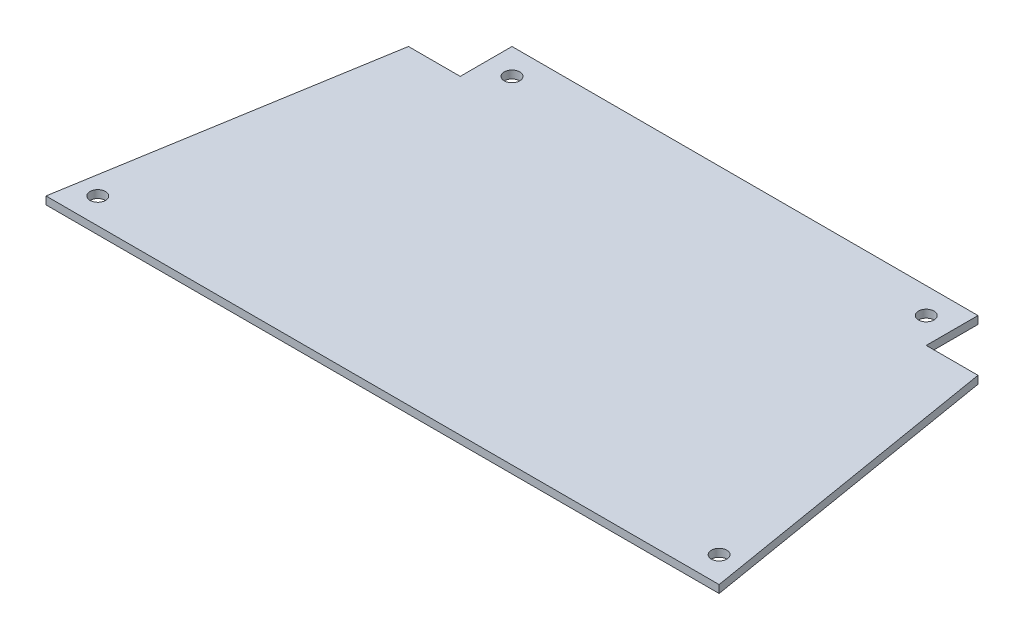
ISO-10303-21;
HEADER;
FILE_DESCRIPTION(('STEP AP214'),'2;1');
FILE_NAME('part.step','',(''),(''),'','','');
FILE_SCHEMA(('AUTOMOTIVE_DESIGN { 1 0 10303 214 1 1 1 1 }'));
ENDSEC;
DATA;
#1=APPLICATION_CONTEXT('core data for automotive mechanical design processes');
#2=APPLICATION_PROTOCOL_DEFINITION('international standard','automotive_design',2000,#1);
#3=PRODUCT_CONTEXT('',#1,'mechanical');
#4=PRODUCT('Part','Part','',(#3));
#5=PRODUCT_RELATED_PRODUCT_CATEGORY('part','',(#4));
#6=PRODUCT_DEFINITION_FORMATION('','',#4);
#7=PRODUCT_DEFINITION_CONTEXT('part definition',#1,'design');
#8=PRODUCT_DEFINITION('design','',#6,#7);
#9=PRODUCT_DEFINITION_SHAPE('','',#8);
#10=(LENGTH_UNIT() NAMED_UNIT(*) SI_UNIT(.MILLI.,.METRE.));
#11=(NAMED_UNIT(*) PLANE_ANGLE_UNIT() SI_UNIT($,.RADIAN.));
#12=(NAMED_UNIT(*) SI_UNIT($,.STERADIAN.) SOLID_ANGLE_UNIT());
#13=UNCERTAINTY_MEASURE_WITH_UNIT(LENGTH_MEASURE(1.E-05),#10,'distance_accuracy_value','');
#14=(GEOMETRIC_REPRESENTATION_CONTEXT(3) GLOBAL_UNCERTAINTY_ASSIGNED_CONTEXT((#13)) GLOBAL_UNIT_ASSIGNED_CONTEXT((#10,
#11,#12)) REPRESENTATION_CONTEXT('',''));
#15=CARTESIAN_POINT('',(0.,0.,0.));
#16=DIRECTION('',(0.,0.,1.));
#17=DIRECTION('',(1.,0.,0.));
#18=AXIS2_PLACEMENT_3D('',#15,#16,#17);
#19=CARTESIAN_POINT('',(10.,1.5,-60.));
#20=DIRECTION('',(0.986393923832144,0.,0.164398987305357));
#21=DIRECTION('',(0.164398987305357,0.,-0.986393923832144));
#22=AXIS2_PLACEMENT_3D('',#19,#20,#21);
#23=PLANE('',#22);
#24=DIRECTION('',(-0.164398987305357,0.,0.986393923832144));
#25=VECTOR('',#24,1.);
#26=CARTESIAN_POINT('',(10.,0.,-60.));
#27=LINE('',#26,#25);
#28=CARTESIAN_POINT('',(10.,0.,-60.));
#29=VERTEX_POINT('',#28);
#30=CARTESIAN_POINT('',(0.,0.,0.));
#31=VERTEX_POINT('',#30);
#32=EDGE_CURVE('E130',#29,#31,#27,.T.);
#33=ORIENTED_EDGE('',*,*,#32,.T.);
#34=DIRECTION('',(0.,-1.,0.));
#35=VECTOR('',#34,1.);
#36=CARTESIAN_POINT('',(0.,1.5,0.));
#37=LINE('',#36,#35);
#38=CARTESIAN_POINT('',(0.,1.5,0.));
#39=VERTEX_POINT('',#38);
#40=EDGE_CURVE('E11',#39,#31,#37,.T.);
#41=ORIENTED_EDGE('',*,*,#40,.F.);
#42=DIRECTION('',(-0.164398987305357,0.,0.986393923832144));
#43=VECTOR('',#42,1.);
#44=CARTESIAN_POINT('',(10.,1.5,-60.));
#45=LINE('',#44,#43);
#46=CARTESIAN_POINT('',(10.,1.5,-60.));
#47=VERTEX_POINT('',#46);
#48=EDGE_CURVE('E145',#47,#39,#45,.T.);
#49=ORIENTED_EDGE('',*,*,#48,.F.);
#50=DIRECTION('',(0.,-1.,0.));
#51=VECTOR('',#50,1.);
#52=CARTESIAN_POINT('',(10.,1.5,-60.));
#53=LINE('',#52,#51);
#54=EDGE_CURVE('E126',#47,#29,#53,.T.);
#55=ORIENTED_EDGE('',*,*,#54,.T.);
#56=EDGE_LOOP('',(#33,#41,#49,#55));
#57=FACE_BOUND('',#56,.T.);
#58=ADVANCED_FACE('F32',(#57),#23,.F.);
#59=CARTESIAN_POINT('',(0.,1.5,0.));
#60=DIRECTION('',(0.,0.,-1.));
#61=DIRECTION('',(-1.,0.,0.));
#62=AXIS2_PLACEMENT_3D('',#59,#60,#61);
#63=PLANE('',#62);
#64=DIRECTION('',(1.,0.,0.));
#65=VECTOR('',#64,1.);
#66=CARTESIAN_POINT('',(0.,0.,0.));
#67=LINE('',#66,#65);
#68=CARTESIAN_POINT('',(130.,0.,0.));
#69=VERTEX_POINT('',#68);
#70=EDGE_CURVE('E133',#31,#69,#67,.T.);
#71=ORIENTED_EDGE('',*,*,#70,.T.);
#72=DIRECTION('',(0.,-1.,0.));
#73=VECTOR('',#72,1.);
#74=CARTESIAN_POINT('',(130.,1.5,0.));
#75=LINE('',#74,#73);
#76=CARTESIAN_POINT('',(130.,1.5,0.));
#77=VERTEX_POINT('',#76);
#78=EDGE_CURVE('E41',#77,#69,#75,.T.);
#79=ORIENTED_EDGE('',*,*,#78,.F.);
#80=DIRECTION('',(1.,0.,0.));
#81=VECTOR('',#80,1.);
#82=CARTESIAN_POINT('',(0.,1.5,0.));
#83=LINE('',#82,#81);
#84=EDGE_CURVE('E93',#39,#77,#83,.T.);
#85=ORIENTED_EDGE('',*,*,#84,.F.);
#86=ORIENTED_EDGE('',*,*,#40,.T.);
#87=EDGE_LOOP('',(#71,#79,#85,#86));
#88=FACE_BOUND('',#87,.T.);
#89=ADVANCED_FACE('F212',(#88),#63,.F.);
#90=CARTESIAN_POINT('',(130.,1.5,0.));
#91=DIRECTION('',(-0.986393923832144,0.,0.164398987305357));
#92=DIRECTION('',(0.164398987305357,0.,0.986393923832144));
#93=AXIS2_PLACEMENT_3D('',#90,#91,#92);
#94=PLANE('',#93);
#95=DIRECTION('',(-0.164398987305357,0.,-0.986393923832144));
#96=VECTOR('',#95,1.);
#97=CARTESIAN_POINT('',(130.,0.,0.));
#98=LINE('',#97,#96);
#99=CARTESIAN_POINT('',(120.,0.,-60.));
#100=VERTEX_POINT('',#99);
#101=EDGE_CURVE('E136',#69,#100,#98,.T.);
#102=ORIENTED_EDGE('',*,*,#101,.T.);
#103=DIRECTION('',(0.,-1.,0.));
#104=VECTOR('',#103,1.);
#105=CARTESIAN_POINT('',(120.,1.5,-60.));
#106=LINE('',#105,#104);
#107=CARTESIAN_POINT('',(120.,1.5,-60.));
#108=VERTEX_POINT('',#107);
#109=EDGE_CURVE('E152',#108,#100,#106,.T.);
#110=ORIENTED_EDGE('',*,*,#109,.F.);
#111=DIRECTION('',(-0.164398987305357,0.,-0.986393923832144));
#112=VECTOR('',#111,1.);
#113=CARTESIAN_POINT('',(130.,1.5,0.));
#114=LINE('',#113,#112);
#115=EDGE_CURVE('E180',#77,#108,#114,.T.);
#116=ORIENTED_EDGE('',*,*,#115,.F.);
#117=ORIENTED_EDGE('',*,*,#78,.T.);
#118=EDGE_LOOP('',(#102,#110,#116,#117));
#119=FACE_BOUND('',#118,.T.);
#120=ADVANCED_FACE('F216',(#119),#94,.F.);
#121=CARTESIAN_POINT('',(120.,1.5,-60.));
#122=DIRECTION('',(0.,0.,1.));
#123=DIRECTION('',(1.,0.,0.));
#124=AXIS2_PLACEMENT_3D('',#121,#122,#123);
#125=PLANE('',#124);
#126=DIRECTION('',(-1.,0.,0.));
#127=VECTOR('',#126,1.);
#128=CARTESIAN_POINT('',(120.,0.,-60.));
#129=LINE('',#128,#127);
#130=CARTESIAN_POINT('',(110.,0.,-60.));
#131=VERTEX_POINT('',#130);
#132=EDGE_CURVE('E138',#100,#131,#129,.T.);
#133=ORIENTED_EDGE('',*,*,#132,.T.);
#134=DIRECTION('',(0.,-1.,0.));
#135=VECTOR('',#134,1.);
#136=CARTESIAN_POINT('',(110.,1.5,-60.));
#137=LINE('',#136,#135);
#138=CARTESIAN_POINT('',(110.,1.5,-60.));
#139=VERTEX_POINT('',#138);
#140=EDGE_CURVE('E149',#139,#131,#137,.T.);
#141=ORIENTED_EDGE('',*,*,#140,.F.);
#142=DIRECTION('',(-1.,0.,0.));
#143=VECTOR('',#142,1.);
#144=CARTESIAN_POINT('',(120.,1.5,-60.));
#145=LINE('',#144,#143);
#146=EDGE_CURVE('E182',#108,#139,#145,.T.);
#147=ORIENTED_EDGE('',*,*,#146,.F.);
#148=ORIENTED_EDGE('',*,*,#109,.T.);
#149=EDGE_LOOP('',(#133,#141,#147,#148));
#150=FACE_BOUND('',#149,.T.);
#151=ADVANCED_FACE('F188',(#150),#125,.F.);
#152=CARTESIAN_POINT('',(110.,1.5,-60.));
#153=DIRECTION('',(-1.,0.,0.));
#154=DIRECTION('',(0.,0.,1.));
#155=AXIS2_PLACEMENT_3D('',#152,#153,#154);
#156=PLANE('',#155);
#157=DIRECTION('',(0.,0.,-1.));
#158=VECTOR('',#157,1.);
#159=CARTESIAN_POINT('',(110.,0.,-60.));
#160=LINE('',#159,#158);
#161=CARTESIAN_POINT('',(110.,0.,-70.));
#162=VERTEX_POINT('',#161);
#163=EDGE_CURVE('E140',#131,#162,#160,.T.);
#164=ORIENTED_EDGE('',*,*,#163,.T.);
#165=DIRECTION('',(0.,-1.,0.));
#166=VECTOR('',#165,1.);
#167=CARTESIAN_POINT('',(110.,1.5,-70.));
#168=LINE('',#167,#166);
#169=CARTESIAN_POINT('',(110.,1.5,-70.));
#170=VERTEX_POINT('',#169);
#171=EDGE_CURVE('E121',#170,#162,#168,.T.);
#172=ORIENTED_EDGE('',*,*,#171,.F.);
#173=DIRECTION('',(0.,0.,-1.));
#174=VECTOR('',#173,1.);
#175=CARTESIAN_POINT('',(110.,1.5,-60.));
#176=LINE('',#175,#174);
#177=EDGE_CURVE('E112',#139,#170,#176,.T.);
#178=ORIENTED_EDGE('',*,*,#177,.F.);
#179=ORIENTED_EDGE('',*,*,#140,.T.);
#180=EDGE_LOOP('',(#164,#172,#178,#179));
#181=FACE_BOUND('',#180,.T.);
#182=ADVANCED_FACE('F192',(#181),#156,.F.);
#183=CARTESIAN_POINT('',(110.,1.5,-70.));
#184=DIRECTION('',(0.,0.,1.));
#185=DIRECTION('',(1.,0.,0.));
#186=AXIS2_PLACEMENT_3D('',#183,#184,#185);
#187=PLANE('',#186);
#188=DIRECTION('',(-1.,0.,0.));
#189=VECTOR('',#188,1.);
#190=CARTESIAN_POINT('',(110.,0.,-70.));
#191=LINE('',#190,#189);
#192=CARTESIAN_POINT('',(20.,0.,-70.));
#193=VERTEX_POINT('',#192);
#194=EDGE_CURVE('E120',#162,#193,#191,.T.);
#195=ORIENTED_EDGE('',*,*,#194,.T.);
#196=DIRECTION('',(0.,-1.,0.));
#197=VECTOR('',#196,1.);
#198=CARTESIAN_POINT('',(20.,1.5,-70.));
#199=LINE('',#198,#197);
#200=CARTESIAN_POINT('',(20.,1.5,-70.));
#201=VERTEX_POINT('',#200);
#202=EDGE_CURVE('E117',#201,#193,#199,.T.);
#203=ORIENTED_EDGE('',*,*,#202,.F.);
#204=DIRECTION('',(-1.,0.,0.));
#205=VECTOR('',#204,1.);
#206=CARTESIAN_POINT('',(110.,1.5,-70.));
#207=LINE('',#206,#205);
#208=EDGE_CURVE('E106',#170,#201,#207,.T.);
#209=ORIENTED_EDGE('',*,*,#208,.F.);
#210=ORIENTED_EDGE('',*,*,#171,.T.);
#211=EDGE_LOOP('',(#195,#203,#209,#210));
#212=FACE_BOUND('',#211,.T.);
#213=ADVANCED_FACE('F118',(#212),#187,.F.);
#214=CARTESIAN_POINT('',(20.,1.5,-70.));
#215=DIRECTION('',(1.,0.,0.));
#216=DIRECTION('',(0.,0.,-1.));
#217=AXIS2_PLACEMENT_3D('',#214,#215,#216);
#218=PLANE('',#217);
#219=DIRECTION('',(0.,0.,1.));
#220=VECTOR('',#219,1.);
#221=CARTESIAN_POINT('',(20.,0.,-70.));
#222=LINE('',#221,#220);
#223=CARTESIAN_POINT('',(20.,0.,-60.));
#224=VERTEX_POINT('',#223);
#225=EDGE_CURVE('E79',#193,#224,#222,.T.);
#226=ORIENTED_EDGE('',*,*,#225,.T.);
#227=DIRECTION('',(0.,-1.,0.));
#228=VECTOR('',#227,1.);
#229=CARTESIAN_POINT('',(20.,1.5,-60.));
#230=LINE('',#229,#228);
#231=CARTESIAN_POINT('',(20.,1.5,-60.));
#232=VERTEX_POINT('',#231);
#233=EDGE_CURVE('E122',#232,#224,#230,.T.);
#234=ORIENTED_EDGE('',*,*,#233,.F.);
#235=DIRECTION('',(0.,0.,1.));
#236=VECTOR('',#235,1.);
#237=CARTESIAN_POINT('',(20.,1.5,-70.));
#238=LINE('',#237,#236);
#239=EDGE_CURVE('E110',#201,#232,#238,.T.);
#240=ORIENTED_EDGE('',*,*,#239,.F.);
#241=ORIENTED_EDGE('',*,*,#202,.T.);
#242=EDGE_LOOP('',(#226,#234,#240,#241));
#243=FACE_BOUND('',#242,.T.);
#244=ADVANCED_FACE('F124',(#243),#218,.F.);
#245=CARTESIAN_POINT('',(20.,1.5,-60.));
#246=DIRECTION('',(0.,0.,1.));
#247=DIRECTION('',(1.,0.,0.));
#248=AXIS2_PLACEMENT_3D('',#245,#246,#247);
#249=PLANE('',#248);
#250=DIRECTION('',(-1.,0.,0.));
#251=VECTOR('',#250,1.);
#252=CARTESIAN_POINT('',(20.,0.,-60.));
#253=LINE('',#252,#251);
#254=EDGE_CURVE('E85',#224,#29,#253,.T.);
#255=ORIENTED_EDGE('',*,*,#254,.T.);
#256=ORIENTED_EDGE('',*,*,#54,.F.);
#257=DIRECTION('',(-1.,0.,0.));
#258=VECTOR('',#257,1.);
#259=CARTESIAN_POINT('',(20.,1.5,-60.));
#260=LINE('',#259,#258);
#261=EDGE_CURVE('E50',#232,#47,#260,.T.);
#262=ORIENTED_EDGE('',*,*,#261,.F.);
#263=ORIENTED_EDGE('',*,*,#233,.T.);
#264=EDGE_LOOP('',(#255,#256,#262,#263));
#265=FACE_BOUND('',#264,.T.);
#266=ADVANCED_FACE('F200',(#265),#249,.F.);
#267=CARTESIAN_POINT('',(0.,1.5,0.));
#268=DIRECTION('',(0.,1.,0.));
#269=DIRECTION('',(0.,0.,1.));
#270=AXIS2_PLACEMENT_3D('',#267,#268,#269);
#271=PLANE('',#270);
#272=CARTESIAN_POINT('',(105.,1.5,-65.));
#273=DIRECTION('',(0.,1.,0.));
#274=DIRECTION('',(0.,0.,1.));
#275=AXIS2_PLACEMENT_3D('',#272,#273,#274);
#276=CIRCLE('',#275,1.5);
#277=CARTESIAN_POINT('',(105.,1.5,-63.5));
#278=VERTEX_POINT('',#277);
#279=EDGE_CURVE('E163',#278,#278,#276,.T.);
#280=ORIENTED_EDGE('',*,*,#279,.F.);
#281=EDGE_LOOP('',(#280));
#282=FACE_BOUND('',#281,.T.);
#283=CARTESIAN_POINT('',(5.,1.5,-5.));
#284=DIRECTION('',(0.,1.,0.));
#285=DIRECTION('',(0.,0.,1.));
#286=AXIS2_PLACEMENT_3D('',#283,#284,#285);
#287=CIRCLE('',#286,1.5);
#288=CARTESIAN_POINT('',(5.,1.5,-3.5));
#289=VERTEX_POINT('',#288);
#290=EDGE_CURVE('E299',#289,#289,#287,.T.);
#291=ORIENTED_EDGE('',*,*,#290,.F.);
#292=EDGE_LOOP('',(#291));
#293=FACE_BOUND('',#292,.T.);
#294=CARTESIAN_POINT('',(125.,1.5,-5.00000000000001));
#295=DIRECTION('',(0.,1.,0.));
#296=DIRECTION('',(0.,0.,1.));
#297=AXIS2_PLACEMENT_3D('',#294,#295,#296);
#298=CIRCLE('',#297,1.5);
#299=CARTESIAN_POINT('',(125.,1.5,-3.50000000000001));
#300=VERTEX_POINT('',#299);
#301=EDGE_CURVE('E176',#300,#300,#298,.T.);
#302=ORIENTED_EDGE('',*,*,#301,.F.);
#303=EDGE_LOOP('',(#302));
#304=FACE_BOUND('',#303,.T.);
#305=CARTESIAN_POINT('',(25.,1.5,-65.));
#306=DIRECTION('',(0.,1.,0.));
#307=DIRECTION('',(0.,0.,1.));
#308=AXIS2_PLACEMENT_3D('',#305,#306,#307);
#309=CIRCLE('',#308,1.5);
#310=CARTESIAN_POINT('',(25.,1.5,-63.5));
#311=VERTEX_POINT('',#310);
#312=EDGE_CURVE('E159',#311,#311,#309,.T.);
#313=ORIENTED_EDGE('',*,*,#312,.F.);
#314=EDGE_LOOP('',(#313));
#315=FACE_BOUND('',#314,.T.);
#316=ORIENTED_EDGE('',*,*,#48,.T.);
#317=ORIENTED_EDGE('',*,*,#84,.T.);
#318=ORIENTED_EDGE('',*,*,#115,.T.);
#319=ORIENTED_EDGE('',*,*,#146,.T.);
#320=ORIENTED_EDGE('',*,*,#177,.T.);
#321=ORIENTED_EDGE('',*,*,#208,.T.);
#322=ORIENTED_EDGE('',*,*,#239,.T.);
#323=ORIENTED_EDGE('',*,*,#261,.T.);
#324=EDGE_LOOP('',(#316,#317,#318,#319,#320,#321,#322,#323));
#325=FACE_BOUND('',#324,.T.);
#326=ADVANCED_FACE('F108',(#282,#293,#304,#315,#325),#271,.T.);
#327=CARTESIAN_POINT('',(0.,0.,0.));
#328=DIRECTION('',(0.,1.,0.));
#329=DIRECTION('',(0.,0.,1.));
#330=AXIS2_PLACEMENT_3D('',#327,#328,#329);
#331=PLANE('',#330);
#332=CARTESIAN_POINT('',(105.,0.,-65.));
#333=DIRECTION('',(0.,1.,0.));
#334=DIRECTION('',(0.,0.,1.));
#335=AXIS2_PLACEMENT_3D('',#332,#333,#334);
#336=CIRCLE('',#335,1.5);
#337=CARTESIAN_POINT('',(105.,0.,-63.5));
#338=VERTEX_POINT('',#337);
#339=EDGE_CURVE('E35',#338,#338,#336,.T.);
#340=ORIENTED_EDGE('',*,*,#339,.T.);
#341=EDGE_LOOP('',(#340));
#342=FACE_BOUND('',#341,.T.);
#343=CARTESIAN_POINT('',(5.,0.,-5.));
#344=DIRECTION('',(0.,1.,0.));
#345=DIRECTION('',(0.,0.,1.));
#346=AXIS2_PLACEMENT_3D('',#343,#344,#345);
#347=CIRCLE('',#346,1.5);
#348=CARTESIAN_POINT('',(5.,0.,-3.5));
#349=VERTEX_POINT('',#348);
#350=EDGE_CURVE('E162',#349,#349,#347,.T.);
#351=ORIENTED_EDGE('',*,*,#350,.T.);
#352=EDGE_LOOP('',(#351));
#353=FACE_BOUND('',#352,.T.);
#354=CARTESIAN_POINT('',(125.,0.,-5.00000000000001));
#355=DIRECTION('',(0.,1.,0.));
#356=DIRECTION('',(0.,0.,1.));
#357=AXIS2_PLACEMENT_3D('',#354,#355,#356);
#358=CIRCLE('',#357,1.5);
#359=CARTESIAN_POINT('',(125.,0.,-3.50000000000001));
#360=VERTEX_POINT('',#359);
#361=EDGE_CURVE('E160',#360,#360,#358,.T.);
#362=ORIENTED_EDGE('',*,*,#361,.T.);
#363=EDGE_LOOP('',(#362));
#364=FACE_BOUND('',#363,.T.);
#365=CARTESIAN_POINT('',(25.,0.,-65.));
#366=DIRECTION('',(0.,1.,0.));
#367=DIRECTION('',(0.,0.,1.));
#368=AXIS2_PLACEMENT_3D('',#365,#366,#367);
#369=CIRCLE('',#368,1.5);
#370=CARTESIAN_POINT('',(25.,0.,-63.5));
#371=VERTEX_POINT('',#370);
#372=EDGE_CURVE('E134',#371,#371,#369,.T.);
#373=ORIENTED_EDGE('',*,*,#372,.T.);
#374=EDGE_LOOP('',(#373));
#375=FACE_BOUND('',#374,.T.);
#376=ORIENTED_EDGE('',*,*,#32,.F.);
#377=ORIENTED_EDGE('',*,*,#254,.F.);
#378=ORIENTED_EDGE('',*,*,#225,.F.);
#379=ORIENTED_EDGE('',*,*,#194,.F.);
#380=ORIENTED_EDGE('',*,*,#163,.F.);
#381=ORIENTED_EDGE('',*,*,#132,.F.);
#382=ORIENTED_EDGE('',*,*,#101,.F.);
#383=ORIENTED_EDGE('',*,*,#70,.F.);
#384=EDGE_LOOP('',(#376,#377,#378,#379,#380,#381,#382,#383));
#385=FACE_BOUND('',#384,.T.);
#386=ADVANCED_FACE('F195',(#342,#353,#364,#375,#385),#331,.F.);
#387=CARTESIAN_POINT('',(25.,-8.5,-65.));
#388=DIRECTION('',(0.,1.,0.));
#389=DIRECTION('',(0.,0.,1.));
#390=AXIS2_PLACEMENT_3D('',#387,#388,#389);
#391=CYLINDRICAL_SURFACE('',#390,1.5);
#392=ORIENTED_EDGE('',*,*,#312,.T.);
#393=EDGE_LOOP('',(#392));
#394=FACE_BOUND('',#393,.T.);
#395=ORIENTED_EDGE('',*,*,#372,.F.);
#396=EDGE_LOOP('',(#395));
#397=FACE_BOUND('',#396,.T.);
#398=ADVANCED_FACE('F255',(#394,#397),#391,.F.);
#399=CARTESIAN_POINT('',(125.,-8.5,-5.00000000000001));
#400=DIRECTION('',(0.,1.,0.));
#401=DIRECTION('',(0.,0.,1.));
#402=AXIS2_PLACEMENT_3D('',#399,#400,#401);
#403=CYLINDRICAL_SURFACE('',#402,1.5);
#404=ORIENTED_EDGE('',*,*,#301,.T.);
#405=EDGE_LOOP('',(#404));
#406=FACE_BOUND('',#405,.T.);
#407=ORIENTED_EDGE('',*,*,#361,.F.);
#408=EDGE_LOOP('',(#407));
#409=FACE_BOUND('',#408,.T.);
#410=ADVANCED_FACE('F263',(#406,#409),#403,.F.);
#411=CARTESIAN_POINT('',(5.,-8.5,-5.));
#412=DIRECTION('',(0.,1.,0.));
#413=DIRECTION('',(0.,0.,1.));
#414=AXIS2_PLACEMENT_3D('',#411,#412,#413);
#415=CYLINDRICAL_SURFACE('',#414,1.5);
#416=ORIENTED_EDGE('',*,*,#290,.T.);
#417=EDGE_LOOP('',(#416));
#418=FACE_BOUND('',#417,.T.);
#419=ORIENTED_EDGE('',*,*,#350,.F.);
#420=EDGE_LOOP('',(#419));
#421=FACE_BOUND('',#420,.T.);
#422=ADVANCED_FACE('F272',(#418,#421),#415,.F.);
#423=CARTESIAN_POINT('',(105.,-8.5,-65.));
#424=DIRECTION('',(0.,1.,0.));
#425=DIRECTION('',(0.,0.,1.));
#426=AXIS2_PLACEMENT_3D('',#423,#424,#425);
#427=CYLINDRICAL_SURFACE('',#426,1.5);
#428=ORIENTED_EDGE('',*,*,#279,.T.);
#429=EDGE_LOOP('',(#428));
#430=FACE_BOUND('',#429,.T.);
#431=ORIENTED_EDGE('',*,*,#339,.F.);
#432=EDGE_LOOP('',(#431));
#433=FACE_BOUND('',#432,.T.);
#434=ADVANCED_FACE('F282',(#430,#433),#427,.F.);
#435=CLOSED_SHELL('',(#58,#89,#120,#151,#182,#213,#244,#266,#326,#386,#398,#410,#422,#434));
#436=MANIFOLD_SOLID_BREP('B2',#435);
#437=ADVANCED_BREP_SHAPE_REPRESENTATION('',(#18,#436),#14);
#438=SHAPE_DEFINITION_REPRESENTATION(#9,#437);
ENDSEC;
END-ISO-10303-21;
